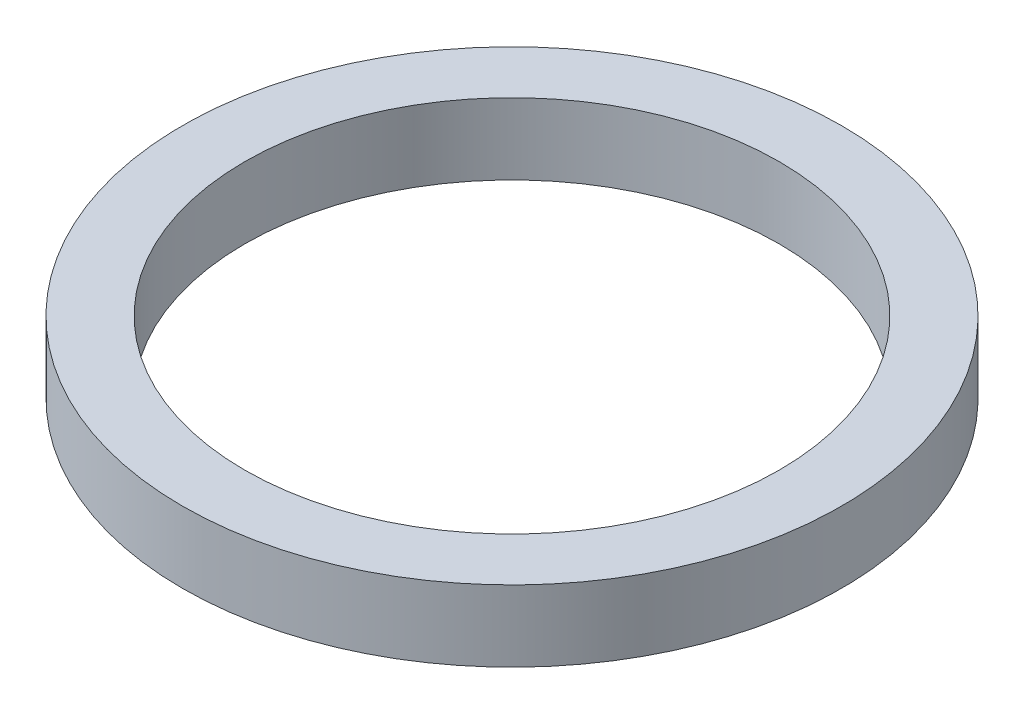
ISO-10303-21;
HEADER;
FILE_DESCRIPTION(('STEP AP214'),'2;1');
FILE_NAME('part.step','',(''),(''),'','','');
FILE_SCHEMA(('AUTOMOTIVE_DESIGN { 1 0 10303 214 1 1 1 1 }'));
ENDSEC;
DATA;
#1=APPLICATION_CONTEXT('core data for automotive mechanical design processes');
#2=APPLICATION_PROTOCOL_DEFINITION('international standard','automotive_design',2000,#1);
#3=PRODUCT_CONTEXT('',#1,'mechanical');
#4=PRODUCT('Part','Part','',(#3));
#5=PRODUCT_RELATED_PRODUCT_CATEGORY('part','',(#4));
#6=PRODUCT_DEFINITION_FORMATION('','',#4);
#7=PRODUCT_DEFINITION_CONTEXT('part definition',#1,'design');
#8=PRODUCT_DEFINITION('design','',#6,#7);
#9=PRODUCT_DEFINITION_SHAPE('','',#8);
#10=(LENGTH_UNIT() NAMED_UNIT(*) SI_UNIT(.MILLI.,.METRE.));
#11=(NAMED_UNIT(*) PLANE_ANGLE_UNIT() SI_UNIT($,.RADIAN.));
#12=(NAMED_UNIT(*) SI_UNIT($,.STERADIAN.) SOLID_ANGLE_UNIT());
#13=UNCERTAINTY_MEASURE_WITH_UNIT(LENGTH_MEASURE(1.E-05),#10,'distance_accuracy_value','');
#14=(GEOMETRIC_REPRESENTATION_CONTEXT(3) GLOBAL_UNCERTAINTY_ASSIGNED_CONTEXT((#13)) GLOBAL_UNIT_ASSIGNED_CONTEXT((#10,
#11,#12)) REPRESENTATION_CONTEXT('',''));
#15=CARTESIAN_POINT('',(0.,0.,0.));
#16=DIRECTION('',(0.,0.,1.));
#17=DIRECTION('',(1.,0.,0.));
#18=AXIS2_PLACEMENT_3D('',#15,#16,#17);
#19=CARTESIAN_POINT('',(0.,2.,0.));
#20=DIRECTION('',(0.,1.,0.));
#21=DIRECTION('',(0.,0.,1.));
#22=AXIS2_PLACEMENT_3D('',#19,#20,#21);
#23=PLANE('',#22);
#24=CARTESIAN_POINT('',(0.,2.,0.));
#25=DIRECTION('',(0.,1.,0.));
#26=DIRECTION('',(0.,0.,1.));
#27=AXIS2_PLACEMENT_3D('',#24,#25,#26);
#28=CIRCLE('',#27,18.5);
#29=CARTESIAN_POINT('',(0.,2.,18.5));
#30=VERTEX_POINT('',#29);
#31=EDGE_CURVE('E10',#30,#30,#28,.T.);
#32=ORIENTED_EDGE('',*,*,#31,.T.);
#33=EDGE_LOOP('',(#32));
#34=FACE_BOUND('',#33,.T.);
#35=CARTESIAN_POINT('',(0.,2.,0.));
#36=DIRECTION('',(0.,1.,0.));
#37=DIRECTION('',(0.,0.,1.));
#38=AXIS2_PLACEMENT_3D('',#35,#36,#37);
#39=CIRCLE('',#38,15.);
#40=CARTESIAN_POINT('',(0.,2.,15.));
#41=VERTEX_POINT('',#40);
#42=EDGE_CURVE('E52',#41,#41,#39,.T.);
#43=ORIENTED_EDGE('',*,*,#42,.F.);
#44=EDGE_LOOP('',(#43));
#45=FACE_BOUND('',#44,.T.);
#46=ADVANCED_FACE('F41',(#34,#45),#23,.T.);
#47=CARTESIAN_POINT('',(0.,-2.,0.));
#48=DIRECTION('',(0.,1.,0.));
#49=DIRECTION('',(0.,0.,1.));
#50=AXIS2_PLACEMENT_3D('',#47,#48,#49);
#51=PLANE('',#50);
#52=CARTESIAN_POINT('',(0.,-2.,0.));
#53=DIRECTION('',(0.,1.,0.));
#54=DIRECTION('',(0.,0.,1.));
#55=AXIS2_PLACEMENT_3D('',#52,#53,#54);
#56=CIRCLE('',#55,18.5);
#57=CARTESIAN_POINT('',(0.,-2.,18.5));
#58=VERTEX_POINT('',#57);
#59=EDGE_CURVE('E45',#58,#58,#56,.T.);
#60=ORIENTED_EDGE('',*,*,#59,.F.);
#61=EDGE_LOOP('',(#60));
#62=FACE_BOUND('',#61,.T.);
#63=CARTESIAN_POINT('',(0.,-2.,0.));
#64=DIRECTION('',(0.,1.,0.));
#65=DIRECTION('',(0.,0.,1.));
#66=AXIS2_PLACEMENT_3D('',#63,#64,#65);
#67=CIRCLE('',#66,15.);
#68=CARTESIAN_POINT('',(0.,-2.,15.));
#69=VERTEX_POINT('',#68);
#70=EDGE_CURVE('E54',#69,#69,#67,.T.);
#71=ORIENTED_EDGE('',*,*,#70,.T.);
#72=EDGE_LOOP('',(#71));
#73=FACE_BOUND('',#72,.T.);
#74=ADVANCED_FACE('F64',(#62,#73),#51,.F.);
#75=CARTESIAN_POINT('',(0.,2.,0.));
#76=DIRECTION('',(0.,-1.,0.));
#77=DIRECTION('',(0.,0.,-1.));
#78=AXIS2_PLACEMENT_3D('',#75,#76,#77);
#79=CYLINDRICAL_SURFACE('',#78,18.5);
#80=ORIENTED_EDGE('',*,*,#31,.F.);
#81=EDGE_LOOP('',(#80));
#82=FACE_BOUND('',#81,.T.);
#83=ORIENTED_EDGE('',*,*,#59,.T.);
#84=EDGE_LOOP('',(#83));
#85=FACE_BOUND('',#84,.T.);
#86=ADVANCED_FACE('F43',(#82,#85),#79,.T.);
#87=CARTESIAN_POINT('',(0.,2.,0.));
#88=DIRECTION('',(0.,-1.,0.));
#89=DIRECTION('',(0.,0.,-1.));
#90=AXIS2_PLACEMENT_3D('',#87,#88,#89);
#91=CYLINDRICAL_SURFACE('',#90,15.);
#92=ORIENTED_EDGE('',*,*,#42,.T.);
#93=EDGE_LOOP('',(#92));
#94=FACE_BOUND('',#93,.T.);
#95=ORIENTED_EDGE('',*,*,#70,.F.);
#96=EDGE_LOOP('',(#95));
#97=FACE_BOUND('',#96,.T.);
#98=ADVANCED_FACE('F60',(#94,#97),#91,.F.);
#99=CLOSED_SHELL('',(#46,#74,#86,#98));
#100=MANIFOLD_SOLID_BREP('B2',#99);
#101=ADVANCED_BREP_SHAPE_REPRESENTATION('',(#18,#100),#14);
#102=SHAPE_DEFINITION_REPRESENTATION(#9,#101);
ENDSEC;
END-ISO-10303-21;
